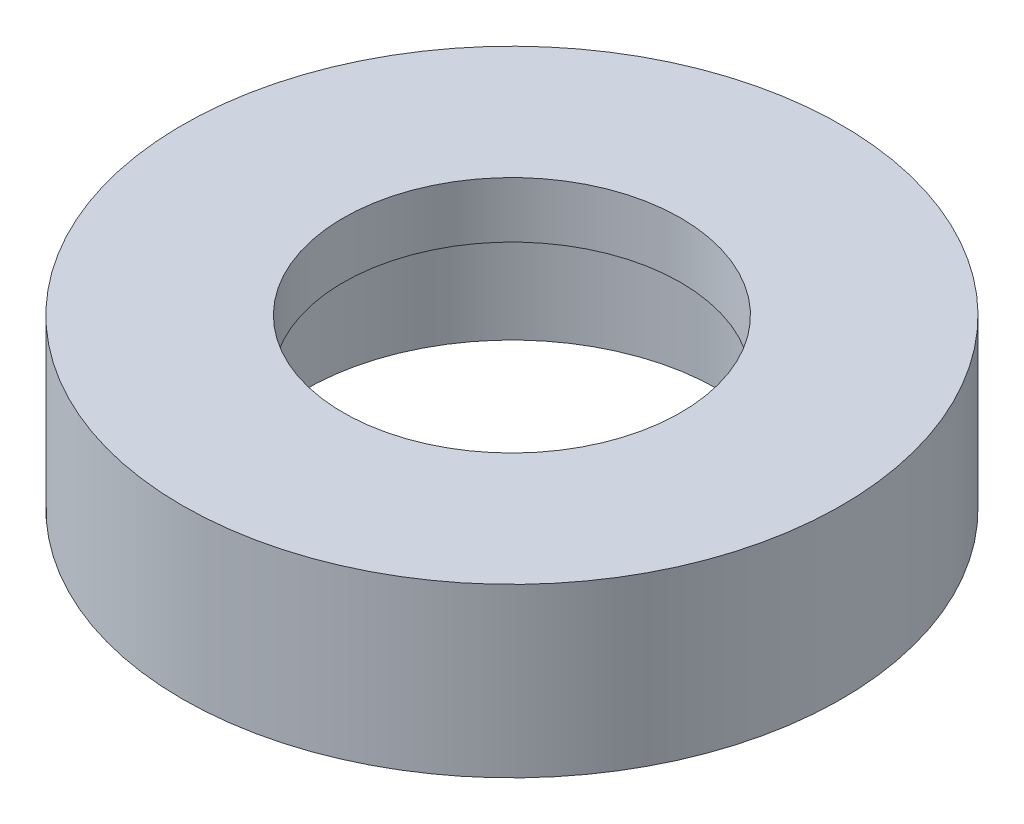
ISO-10303-21;
HEADER;
FILE_DESCRIPTION(('STEP AP214'),'2;1');
FILE_NAME('part.step','',(''),(''),'','','');
FILE_SCHEMA(('AUTOMOTIVE_DESIGN { 1 0 10303 214 1 1 1 1 }'));
ENDSEC;
DATA;
#1=APPLICATION_CONTEXT('core data for automotive mechanical design processes');
#2=APPLICATION_PROTOCOL_DEFINITION('international standard','automotive_design',2000,#1);
#3=PRODUCT_CONTEXT('',#1,'mechanical');
#4=PRODUCT('Part','Part','',(#3));
#5=PRODUCT_RELATED_PRODUCT_CATEGORY('part','',(#4));
#6=PRODUCT_DEFINITION_FORMATION('','',#4);
#7=PRODUCT_DEFINITION_CONTEXT('part definition',#1,'design');
#8=PRODUCT_DEFINITION('design','',#6,#7);
#9=PRODUCT_DEFINITION_SHAPE('','',#8);
#10=(LENGTH_UNIT() NAMED_UNIT(*) SI_UNIT(.MILLI.,.METRE.));
#11=(NAMED_UNIT(*) PLANE_ANGLE_UNIT() SI_UNIT($,.RADIAN.));
#12=(NAMED_UNIT(*) SI_UNIT($,.STERADIAN.) SOLID_ANGLE_UNIT());
#13=UNCERTAINTY_MEASURE_WITH_UNIT(LENGTH_MEASURE(1.E-05),#10,'distance_accuracy_value','');
#14=(GEOMETRIC_REPRESENTATION_CONTEXT(3) GLOBAL_UNCERTAINTY_ASSIGNED_CONTEXT((#13)) GLOBAL_UNIT_ASSIGNED_CONTEXT((#10,
#11,#12)) REPRESENTATION_CONTEXT('',''));
#15=CARTESIAN_POINT('',(0.,0.,0.));
#16=DIRECTION('',(0.,0.,1.));
#17=DIRECTION('',(1.,0.,0.));
#18=AXIS2_PLACEMENT_3D('',#15,#16,#17);
#19=CARTESIAN_POINT('',(0.,15.,0.));
#20=DIRECTION('',(0.,-1.,0.));
#21=DIRECTION('',(0.,0.,-1.));
#22=AXIS2_PLACEMENT_3D('',#19,#20,#21);
#23=CYLINDRICAL_SURFACE('',#22,15.1);
#24=CARTESIAN_POINT('',(0.,15.,0.));
#25=DIRECTION('',(0.,-1.,0.));
#26=DIRECTION('',(0.,0.,-1.));
#27=AXIS2_PLACEMENT_3D('',#24,#25,#26);
#28=CIRCLE('',#27,15.1);
#29=CARTESIAN_POINT('',(0.,15.,-15.1));
#30=VERTEX_POINT('',#29);
#31=EDGE_CURVE('E78',#30,#30,#28,.T.);
#32=ORIENTED_EDGE('',*,*,#31,.F.);
#33=EDGE_LOOP('',(#32));
#34=FACE_BOUND('',#33,.T.);
#35=CARTESIAN_POINT('',(0.,10.,0.));
#36=DIRECTION('',(0.,-1.,0.));
#37=DIRECTION('',(0.,0.,-1.));
#38=AXIS2_PLACEMENT_3D('',#35,#36,#37);
#39=CIRCLE('',#38,15.1);
#40=CARTESIAN_POINT('',(0.,10.,-15.1));
#41=VERTEX_POINT('',#40);
#42=EDGE_CURVE('E74',#41,#41,#39,.F.);
#43=ORIENTED_EDGE('',*,*,#42,.F.);
#44=EDGE_LOOP('',(#43));
#45=FACE_BOUND('',#44,.T.);
#46=ADVANCED_FACE('F35',(#34,#45),#23,.F.);
#47=CARTESIAN_POINT('',(0.,15.,0.));
#48=DIRECTION('',(0.,-1.,0.));
#49=DIRECTION('',(0.,0.,-1.));
#50=AXIS2_PLACEMENT_3D('',#47,#48,#49);
#51=CYLINDRICAL_SURFACE('',#50,29.5);
#52=CARTESIAN_POINT('',(0.,15.,0.));
#53=DIRECTION('',(0.,1.,0.));
#54=DIRECTION('',(0.,0.,1.));
#55=AXIS2_PLACEMENT_3D('',#52,#53,#54);
#56=CIRCLE('',#55,29.5);
#57=CARTESIAN_POINT('',(0.,15.,29.5));
#58=VERTEX_POINT('',#57);
#59=EDGE_CURVE('E82',#58,#58,#56,.T.);
#60=ORIENTED_EDGE('',*,*,#59,.F.);
#61=EDGE_LOOP('',(#60));
#62=FACE_BOUND('',#61,.T.);
#63=CARTESIAN_POINT('',(0.,0.,0.));
#64=DIRECTION('',(0.,1.,0.));
#65=DIRECTION('',(0.,0.,1.));
#66=AXIS2_PLACEMENT_3D('',#63,#64,#65);
#67=CIRCLE('',#66,29.5);
#68=CARTESIAN_POINT('',(0.,0.,29.5));
#69=VERTEX_POINT('',#68);
#70=EDGE_CURVE('E81',#69,#69,#67,.T.);
#71=ORIENTED_EDGE('',*,*,#70,.T.);
#72=EDGE_LOOP('',(#71));
#73=FACE_BOUND('',#72,.T.);
#74=ADVANCED_FACE('F37',(#62,#73),#51,.T.);
#75=CARTESIAN_POINT('',(0.,15.,0.));
#76=DIRECTION('',(0.,1.,0.));
#77=DIRECTION('',(0.,0.,1.));
#78=AXIS2_PLACEMENT_3D('',#75,#76,#77);
#79=PLANE('',#78);
#80=ORIENTED_EDGE('',*,*,#31,.T.);
#81=EDGE_LOOP('',(#80));
#82=FACE_BOUND('',#81,.T.);
#83=ORIENTED_EDGE('',*,*,#59,.T.);
#84=EDGE_LOOP('',(#83));
#85=FACE_BOUND('',#84,.T.);
#86=ADVANCED_FACE('F101',(#82,#85),#79,.T.);
#87=CARTESIAN_POINT('',(0.,0.,0.));
#88=DIRECTION('',(0.,1.,0.));
#89=DIRECTION('',(0.,0.,1.));
#90=AXIS2_PLACEMENT_3D('',#87,#88,#89);
#91=PLANE('',#90);
#92=CARTESIAN_POINT('',(0.,0.,0.));
#93=DIRECTION('',(0.,-1.,0.));
#94=DIRECTION('',(0.,0.,-1.));
#95=AXIS2_PLACEMENT_3D('',#92,#93,#94);
#96=CIRCLE('',#95,18.5);
#97=CARTESIAN_POINT('',(15.533517256308,0.,10.0478774697934));
#98=VERTEX_POINT('',#97);
#99=CARTESIAN_POINT('',(18.1033350830687,0.,3.81041452733599));
#100=VERTEX_POINT('',#99);
#101=EDGE_CURVE('E68',#98,#100,#96,.T.);
#102=ORIENTED_EDGE('',*,*,#101,.F.);
#103=CARTESIAN_POINT('',(21.4064036569979,0.,8.81938028844089));
#104=DIRECTION('',(0.,-1.,0.));
#105=DIRECTION('',(0.,0.,-1.));
#106=AXIS2_PLACEMENT_3D('',#103,#104,#105);
#107=CIRCLE('',#106,6.);
#108=EDGE_CURVE('E58',#100,#98,#107,.T.);
#109=ORIENTED_EDGE('',*,*,#108,.F.);
#110=EDGE_LOOP('',(#102,#109));
#111=FACE_BOUND('',#110,.T.);
#112=ORIENTED_EDGE('',*,*,#70,.F.);
#113=EDGE_LOOP('',(#112));
#114=FACE_BOUND('',#113,.T.);
#115=ADVANCED_FACE('F71',(#111,#114),#91,.F.);
#116=CARTESIAN_POINT('',(0.,10.,0.));
#117=DIRECTION('',(0.,-1.,0.));
#118=DIRECTION('',(0.,0.,-1.));
#119=AXIS2_PLACEMENT_3D('',#116,#117,#118);
#120=PLANE('',#119);
#121=CARTESIAN_POINT('',(21.4064036569979,10.,8.81938028844089));
#122=DIRECTION('',(0.,-1.,0.));
#123=DIRECTION('',(0.,0.,-1.));
#124=AXIS2_PLACEMENT_3D('',#121,#122,#123);
#125=CIRCLE('',#124,6.);
#126=CARTESIAN_POINT('',(15.533517256308,10.,10.0478774697934));
#127=VERTEX_POINT('',#126);
#128=CARTESIAN_POINT('',(18.1033350830687,10.,3.81041452733599));
#129=VERTEX_POINT('',#128);
#130=EDGE_CURVE('E50',#127,#129,#125,.T.);
#131=ORIENTED_EDGE('',*,*,#130,.F.);
#132=CARTESIAN_POINT('',(0.,10.,0.));
#133=DIRECTION('',(0.,-1.,0.));
#134=DIRECTION('',(0.,0.,-1.));
#135=AXIS2_PLACEMENT_3D('',#132,#133,#134);
#136=CIRCLE('',#135,18.5);
#137=EDGE_CURVE('E70',#127,#129,#136,.T.);
#138=ORIENTED_EDGE('',*,*,#137,.T.);
#139=EDGE_LOOP('',(#131,#138));
#140=FACE_BOUND('',#139,.T.);
#141=ORIENTED_EDGE('',*,*,#42,.T.);
#142=EDGE_LOOP('',(#141));
#143=FACE_BOUND('',#142,.T.);
#144=ADVANCED_FACE('F89',(#140,#143),#120,.T.);
#145=CARTESIAN_POINT('',(0.,10.,0.));
#146=DIRECTION('',(0.,-1.,0.));
#147=DIRECTION('',(0.,0.,-1.));
#148=AXIS2_PLACEMENT_3D('',#145,#146,#147);
#149=CYLINDRICAL_SURFACE('',#148,18.5);
#150=ORIENTED_EDGE('',*,*,#137,.F.);
#151=DIRECTION('',(0.,-1.,0.));
#152=VECTOR('',#151,1.);
#153=CARTESIAN_POINT('',(15.533517256308,5.25,10.0478774697934));
#154=LINE('',#153,#152);
#155=EDGE_CURVE('E11',#127,#98,#154,.T.);
#156=ORIENTED_EDGE('',*,*,#155,.T.);
#157=ORIENTED_EDGE('',*,*,#101,.T.);
#158=DIRECTION('',(0.,-1.,0.));
#159=VECTOR('',#158,1.);
#160=CARTESIAN_POINT('',(18.1033350830687,5.25,3.81041452733599));
#161=LINE('',#160,#159);
#162=EDGE_CURVE('E43',#100,#129,#161,.F.);
#163=ORIENTED_EDGE('',*,*,#162,.T.);
#164=EDGE_LOOP('',(#150,#156,#157,#163));
#165=FACE_BOUND('',#164,.T.);
#166=ADVANCED_FACE('F67',(#165),#149,.F.);
#167=CARTESIAN_POINT('',(21.4064036569979,10.5,8.81938028844089));
#168=DIRECTION('',(0.,-1.,0.));
#169=DIRECTION('',(0.,0.,-1.));
#170=AXIS2_PLACEMENT_3D('',#167,#168,#169);
#171=CYLINDRICAL_SURFACE('',#170,6.);
#172=CARTESIAN_POINT('',(21.4064036569979,10.5,8.81938028844089));
#173=DIRECTION('',(0.,-1.,0.));
#174=DIRECTION('',(0.,0.,-1.));
#175=AXIS2_PLACEMENT_3D('',#172,#173,#174);
#176=CIRCLE('',#175,6.);
#177=CARTESIAN_POINT('',(21.4064036569979,10.5,2.81938028844089));
#178=VERTEX_POINT('',#177);
#179=EDGE_CURVE('E63',#178,#178,#176,.T.);
#180=ORIENTED_EDGE('',*,*,#179,.F.);
#181=EDGE_LOOP('',(#180));
#182=FACE_BOUND('',#181,.T.);
#183=ORIENTED_EDGE('',*,*,#130,.T.);
#184=ORIENTED_EDGE('',*,*,#162,.F.);
#185=ORIENTED_EDGE('',*,*,#108,.T.);
#186=ORIENTED_EDGE('',*,*,#155,.F.);
#187=EDGE_LOOP('',(#183,#184,#185,#186));
#188=FACE_BOUND('',#187,.T.);
#189=ADVANCED_FACE('F59',(#182,#188),#171,.F.);
#190=CARTESIAN_POINT('',(21.4064036569979,10.5,8.81938028844089));
#191=DIRECTION('',(0.,-1.,0.));
#192=DIRECTION('',(0.,0.,-1.));
#193=AXIS2_PLACEMENT_3D('',#190,#191,#192);
#194=PLANE('',#193);
#195=ORIENTED_EDGE('',*,*,#179,.T.);
#196=EDGE_LOOP('',(#195));
#197=FACE_BOUND('',#196,.T.);
#198=ADVANCED_FACE('F130',(#197),#194,.T.);
#199=CLOSED_SHELL('',(#46,#74,#86,#115,#144,#166,#189,#198));
#200=MANIFOLD_SOLID_BREP('B2',#199);
#201=ADVANCED_BREP_SHAPE_REPRESENTATION('',(#18,#200),#14);
#202=SHAPE_DEFINITION_REPRESENTATION(#9,#201);
ENDSEC;
END-ISO-10303-21;
